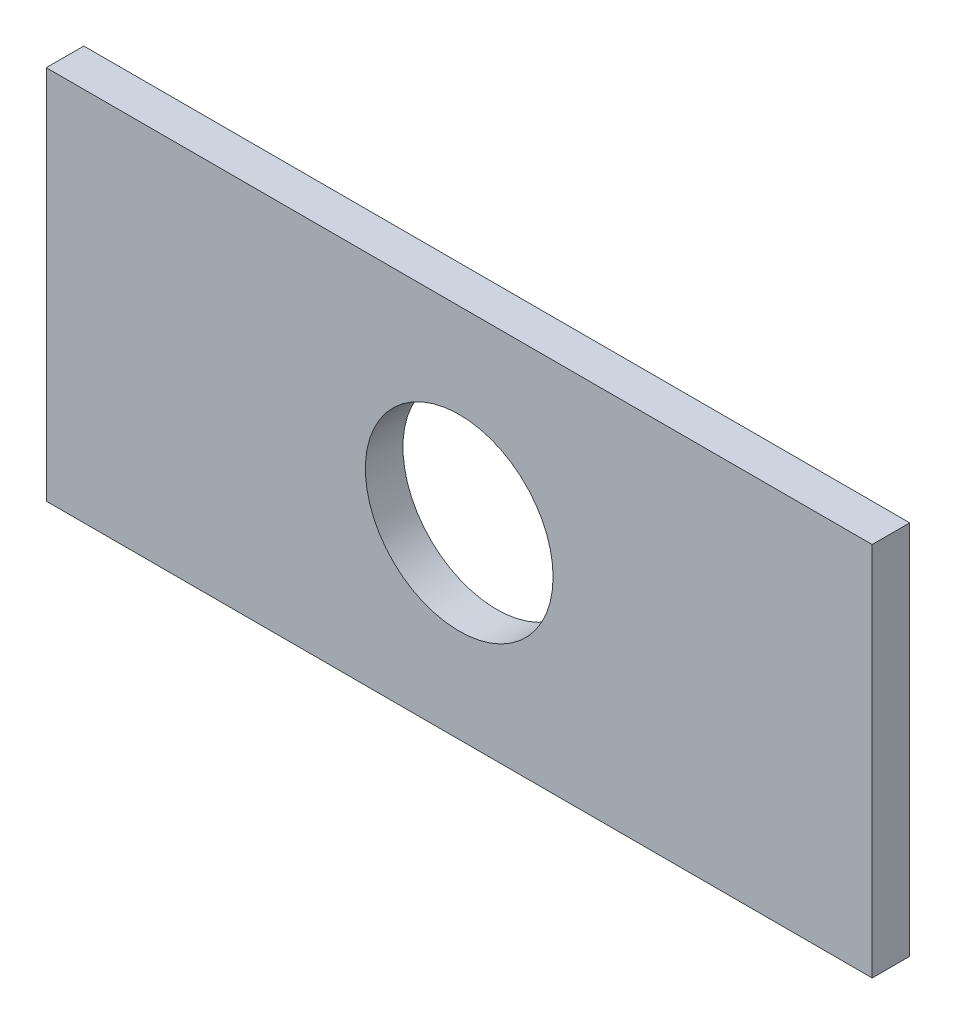
ISO-10303-21;
HEADER;
FILE_DESCRIPTION(('STEP AP214'),'2;1');
FILE_NAME('part.step','',(''),(''),'','','');
FILE_SCHEMA(('AUTOMOTIVE_DESIGN { 1 0 10303 214 1 1 1 1 }'));
ENDSEC;
DATA;
#1=APPLICATION_CONTEXT('core data for automotive mechanical design processes');
#2=APPLICATION_PROTOCOL_DEFINITION('international standard','automotive_design',2000,#1);
#3=PRODUCT_CONTEXT('',#1,'mechanical');
#4=PRODUCT('Part','Part','',(#3));
#5=PRODUCT_RELATED_PRODUCT_CATEGORY('part','',(#4));
#6=PRODUCT_DEFINITION_FORMATION('','',#4);
#7=PRODUCT_DEFINITION_CONTEXT('part definition',#1,'design');
#8=PRODUCT_DEFINITION('design','',#6,#7);
#9=PRODUCT_DEFINITION_SHAPE('','',#8);
#10=(LENGTH_UNIT() NAMED_UNIT(*) SI_UNIT(.MILLI.,.METRE.));
#11=(NAMED_UNIT(*) PLANE_ANGLE_UNIT() SI_UNIT($,.RADIAN.));
#12=(NAMED_UNIT(*) SI_UNIT($,.STERADIAN.) SOLID_ANGLE_UNIT());
#13=UNCERTAINTY_MEASURE_WITH_UNIT(LENGTH_MEASURE(1.E-05),#10,'distance_accuracy_value','');
#14=(GEOMETRIC_REPRESENTATION_CONTEXT(3) GLOBAL_UNCERTAINTY_ASSIGNED_CONTEXT((#13)) GLOBAL_UNIT_ASSIGNED_CONTEXT((#10,
#11,#12)) REPRESENTATION_CONTEXT('',''));
#15=CARTESIAN_POINT('',(0.,0.,0.));
#16=DIRECTION('',(0.,0.,1.));
#17=DIRECTION('',(1.,0.,0.));
#18=AXIS2_PLACEMENT_3D('',#15,#16,#17);
#19=CARTESIAN_POINT('',(0.,0.,2.5));
#20=DIRECTION('',(0.,0.,-1.));
#21=DIRECTION('',(-1.,0.,0.));
#22=AXIS2_PLACEMENT_3D('',#19,#20,#21);
#23=PLANE('',#22);
#24=DIRECTION('',(0.,-1.,0.));
#25=VECTOR('',#24,1.);
#26=CARTESIAN_POINT('',(-250.725373134328,27.2228358208955,2.5));
#27=LINE('',#26,#25);
#28=CARTESIAN_POINT('',(-250.725373134328,52.2228358208955,2.5));
#29=VERTEX_POINT('',#28);
#30=CARTESIAN_POINT('',(-250.725373134328,27.2228358208955,2.5));
#31=VERTEX_POINT('',#30);
#32=EDGE_CURVE('E94',#29,#31,#27,.T.);
#33=ORIENTED_EDGE('',*,*,#32,.T.);
#34=DIRECTION('',(1.,0.,0.));
#35=VECTOR('',#34,1.);
#36=CARTESIAN_POINT('',(-195.725373134328,27.2228358208955,2.5));
#37=LINE('',#36,#35);
#38=CARTESIAN_POINT('',(-195.725373134328,27.2228358208955,2.5));
#39=VERTEX_POINT('',#38);
#40=EDGE_CURVE('E89',#31,#39,#37,.T.);
#41=ORIENTED_EDGE('',*,*,#40,.T.);
#42=DIRECTION('',(0.,1.,0.));
#43=VECTOR('',#42,1.);
#44=CARTESIAN_POINT('',(-195.725373134328,52.2228358208955,2.5));
#45=LINE('',#44,#43);
#46=CARTESIAN_POINT('',(-195.725373134328,52.2228358208955,2.5));
#47=VERTEX_POINT('',#46);
#48=EDGE_CURVE('E92',#39,#47,#45,.T.);
#49=ORIENTED_EDGE('',*,*,#48,.T.);
#50=DIRECTION('',(-1.,0.,0.));
#51=VECTOR('',#50,1.);
#52=CARTESIAN_POINT('',(-250.725373134328,52.2228358208955,2.5));
#53=LINE('',#52,#51);
#54=EDGE_CURVE('E59',#47,#29,#53,.T.);
#55=ORIENTED_EDGE('',*,*,#54,.T.);
#56=EDGE_LOOP('',(#33,#41,#49,#55));
#57=FACE_BOUND('',#56,.T.);
#58=CARTESIAN_POINT('',(-223.225373134328,39.7228358208955,2.5));
#59=DIRECTION('',(0.,0.,1.));
#60=DIRECTION('',(1.,0.,0.));
#61=AXIS2_PLACEMENT_3D('',#58,#59,#60);
#62=CIRCLE('',#61,6.25000000000002);
#63=CARTESIAN_POINT('',(-216.975373134328,39.7228358208955,2.5));
#64=VERTEX_POINT('',#63);
#65=EDGE_CURVE('E114',#64,#64,#62,.T.);
#66=ORIENTED_EDGE('',*,*,#65,.F.);
#67=EDGE_LOOP('',(#66));
#68=FACE_BOUND('',#67,.T.);
#69=ADVANCED_FACE('F41',(#57,#68),#23,.F.);
#70=CARTESIAN_POINT('',(0.,0.,0.));
#71=DIRECTION('',(0.,0.,-1.));
#72=DIRECTION('',(-1.,0.,0.));
#73=AXIS2_PLACEMENT_3D('',#70,#71,#72);
#74=PLANE('',#73);
#75=DIRECTION('',(0.,-1.,0.));
#76=VECTOR('',#75,1.);
#77=CARTESIAN_POINT('',(-250.725373134328,27.2228358208955,0.));
#78=LINE('',#77,#76);
#79=CARTESIAN_POINT('',(-250.725373134328,52.2228358208955,0.));
#80=VERTEX_POINT('',#79);
#81=CARTESIAN_POINT('',(-250.725373134328,27.2228358208955,0.));
#82=VERTEX_POINT('',#81);
#83=EDGE_CURVE('E110',#80,#82,#78,.T.);
#84=ORIENTED_EDGE('',*,*,#83,.F.);
#85=DIRECTION('',(-1.,0.,0.));
#86=VECTOR('',#85,1.);
#87=CARTESIAN_POINT('',(-250.725373134328,52.2228358208955,0.));
#88=LINE('',#87,#86);
#89=CARTESIAN_POINT('',(-195.725373134328,52.2228358208955,0.));
#90=VERTEX_POINT('',#89);
#91=EDGE_CURVE('E82',#90,#80,#88,.T.);
#92=ORIENTED_EDGE('',*,*,#91,.F.);
#93=DIRECTION('',(0.,1.,0.));
#94=VECTOR('',#93,1.);
#95=CARTESIAN_POINT('',(-195.725373134328,52.2228358208955,0.));
#96=LINE('',#95,#94);
#97=CARTESIAN_POINT('',(-195.725373134328,27.2228358208955,0.));
#98=VERTEX_POINT('',#97);
#99=EDGE_CURVE('E76',#98,#90,#96,.T.);
#100=ORIENTED_EDGE('',*,*,#99,.F.);
#101=DIRECTION('',(1.,0.,0.));
#102=VECTOR('',#101,1.);
#103=CARTESIAN_POINT('',(-195.725373134328,27.2228358208955,0.));
#104=LINE('',#103,#102);
#105=EDGE_CURVE('E99',#82,#98,#104,.T.);
#106=ORIENTED_EDGE('',*,*,#105,.F.);
#107=EDGE_LOOP('',(#84,#92,#100,#106));
#108=FACE_BOUND('',#107,.T.);
#109=CARTESIAN_POINT('',(-223.225373134328,39.7228358208955,0.));
#110=DIRECTION('',(0.,0.,1.));
#111=DIRECTION('',(1.,0.,0.));
#112=AXIS2_PLACEMENT_3D('',#109,#110,#111);
#113=CIRCLE('',#112,6.25000000000002);
#114=CARTESIAN_POINT('',(-216.975373134328,39.7228358208955,0.));
#115=VERTEX_POINT('',#114);
#116=EDGE_CURVE('E132',#115,#115,#113,.T.);
#117=ORIENTED_EDGE('',*,*,#116,.T.);
#118=EDGE_LOOP('',(#117));
#119=FACE_BOUND('',#118,.T.);
#120=ADVANCED_FACE('F127',(#108,#119),#74,.T.);
#121=CARTESIAN_POINT('',(-250.725373134328,27.2228358208955,2.5));
#122=DIRECTION('',(1.,0.,0.));
#123=DIRECTION('',(0.,0.,-1.));
#124=AXIS2_PLACEMENT_3D('',#121,#122,#123);
#125=PLANE('',#124);
#126=ORIENTED_EDGE('',*,*,#83,.T.);
#127=DIRECTION('',(0.,0.,-1.));
#128=VECTOR('',#127,1.);
#129=CARTESIAN_POINT('',(-250.725373134328,27.2228358208955,2.5));
#130=LINE('',#129,#128);
#131=EDGE_CURVE('E11',#31,#82,#130,.T.);
#132=ORIENTED_EDGE('',*,*,#131,.F.);
#133=ORIENTED_EDGE('',*,*,#32,.F.);
#134=DIRECTION('',(0.,0.,-1.));
#135=VECTOR('',#134,1.);
#136=CARTESIAN_POINT('',(-250.725373134328,52.2228358208955,2.5));
#137=LINE('',#136,#135);
#138=EDGE_CURVE('E106',#29,#80,#137,.T.);
#139=ORIENTED_EDGE('',*,*,#138,.T.);
#140=EDGE_LOOP('',(#126,#132,#133,#139));
#141=FACE_BOUND('',#140,.T.);
#142=ADVANCED_FACE('F43',(#141),#125,.F.);
#143=CARTESIAN_POINT('',(-195.725373134328,27.2228358208955,2.5));
#144=DIRECTION('',(0.,1.,0.));
#145=DIRECTION('',(-1.,0.,0.));
#146=AXIS2_PLACEMENT_3D('',#143,#144,#145);
#147=PLANE('',#146);
#148=ORIENTED_EDGE('',*,*,#105,.T.);
#149=DIRECTION('',(0.,0.,-1.));
#150=VECTOR('',#149,1.);
#151=CARTESIAN_POINT('',(-195.725373134328,27.2228358208955,2.5));
#152=LINE('',#151,#150);
#153=EDGE_CURVE('E51',#39,#98,#152,.T.);
#154=ORIENTED_EDGE('',*,*,#153,.F.);
#155=ORIENTED_EDGE('',*,*,#40,.F.);
#156=ORIENTED_EDGE('',*,*,#131,.T.);
#157=EDGE_LOOP('',(#148,#154,#155,#156));
#158=FACE_BOUND('',#157,.T.);
#159=ADVANCED_FACE('F98',(#158),#147,.F.);
#160=CARTESIAN_POINT('',(-195.725373134328,52.2228358208955,2.5));
#161=DIRECTION('',(-1.,0.,0.));
#162=DIRECTION('',(0.,0.,1.));
#163=AXIS2_PLACEMENT_3D('',#160,#161,#162);
#164=PLANE('',#163);
#165=ORIENTED_EDGE('',*,*,#99,.T.);
#166=DIRECTION('',(0.,0.,-1.));
#167=VECTOR('',#166,1.);
#168=CARTESIAN_POINT('',(-195.725373134328,52.2228358208955,2.5));
#169=LINE('',#168,#167);
#170=EDGE_CURVE('E101',#47,#90,#169,.T.);
#171=ORIENTED_EDGE('',*,*,#170,.F.);
#172=ORIENTED_EDGE('',*,*,#48,.F.);
#173=ORIENTED_EDGE('',*,*,#153,.T.);
#174=EDGE_LOOP('',(#165,#171,#172,#173));
#175=FACE_BOUND('',#174,.T.);
#176=ADVANCED_FACE('F102',(#175),#164,.F.);
#177=CARTESIAN_POINT('',(-250.725373134328,52.2228358208955,2.5));
#178=DIRECTION('',(0.,-1.,0.));
#179=DIRECTION('',(0.,0.,-1.));
#180=AXIS2_PLACEMENT_3D('',#177,#178,#179);
#181=PLANE('',#180);
#182=ORIENTED_EDGE('',*,*,#91,.T.);
#183=ORIENTED_EDGE('',*,*,#138,.F.);
#184=ORIENTED_EDGE('',*,*,#54,.F.);
#185=ORIENTED_EDGE('',*,*,#170,.T.);
#186=EDGE_LOOP('',(#182,#183,#184,#185));
#187=FACE_BOUND('',#186,.T.);
#188=ADVANCED_FACE('F124',(#187),#181,.F.);
#189=CARTESIAN_POINT('',(-223.225373134328,39.7228358208955,2.5));
#190=DIRECTION('',(0.,0.,-1.));
#191=DIRECTION('',(-1.,0.,0.));
#192=AXIS2_PLACEMENT_3D('',#189,#190,#191);
#193=CYLINDRICAL_SURFACE('',#192,6.25000000000002);
#194=ORIENTED_EDGE('',*,*,#65,.T.);
#195=EDGE_LOOP('',(#194));
#196=FACE_BOUND('',#195,.T.);
#197=ORIENTED_EDGE('',*,*,#116,.F.);
#198=EDGE_LOOP('',(#197));
#199=FACE_BOUND('',#198,.T.);
#200=ADVANCED_FACE('F140',(#196,#199),#193,.F.);
#201=CLOSED_SHELL('',(#69,#120,#142,#159,#176,#188,#200));
#202=MANIFOLD_SOLID_BREP('B2',#201);
#203=ADVANCED_BREP_SHAPE_REPRESENTATION('',(#18,#202),#14);
#204=SHAPE_DEFINITION_REPRESENTATION(#9,#203);
ENDSEC;
END-ISO-10303-21;
